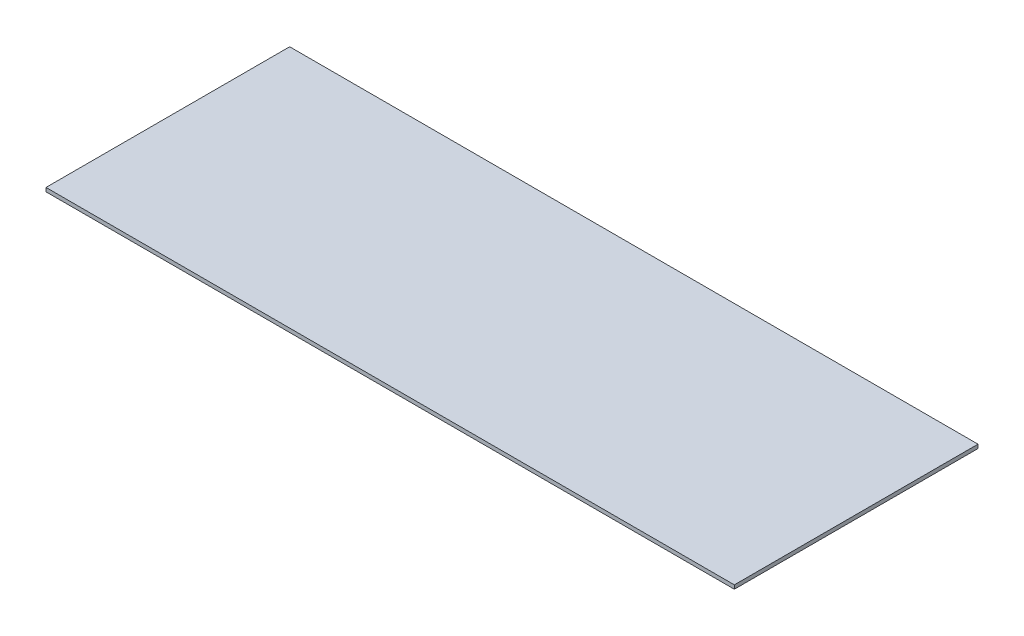
ISO-10303-21;
HEADER;
FILE_DESCRIPTION(('STEP AP214'),'2;1');
FILE_NAME('part.step','',(''),(''),'','','');
FILE_SCHEMA(('AUTOMOTIVE_DESIGN { 1 0 10303 214 1 1 1 1 }'));
ENDSEC;
DATA;
#1=APPLICATION_CONTEXT('core data for automotive mechanical design processes');
#2=APPLICATION_PROTOCOL_DEFINITION('international standard','automotive_design',2000,#1);
#3=PRODUCT_CONTEXT('',#1,'mechanical');
#4=PRODUCT('Part','Part','',(#3));
#5=PRODUCT_RELATED_PRODUCT_CATEGORY('part','',(#4));
#6=PRODUCT_DEFINITION_FORMATION('','',#4);
#7=PRODUCT_DEFINITION_CONTEXT('part definition',#1,'design');
#8=PRODUCT_DEFINITION('design','',#6,#7);
#9=PRODUCT_DEFINITION_SHAPE('','',#8);
#10=(LENGTH_UNIT() NAMED_UNIT(*) SI_UNIT(.MILLI.,.METRE.));
#11=(NAMED_UNIT(*) PLANE_ANGLE_UNIT() SI_UNIT($,.RADIAN.));
#12=(NAMED_UNIT(*) SI_UNIT($,.STERADIAN.) SOLID_ANGLE_UNIT());
#13=UNCERTAINTY_MEASURE_WITH_UNIT(LENGTH_MEASURE(1.E-05),#10,'distance_accuracy_value','');
#14=(GEOMETRIC_REPRESENTATION_CONTEXT(3) GLOBAL_UNCERTAINTY_ASSIGNED_CONTEXT((#13)) GLOBAL_UNIT_ASSIGNED_CONTEXT((#10,
#11,#12)) REPRESENTATION_CONTEXT('',''));
#15=CARTESIAN_POINT('',(0.,0.,0.));
#16=DIRECTION('',(0.,0.,1.));
#17=DIRECTION('',(1.,0.,0.));
#18=AXIS2_PLACEMENT_3D('',#15,#16,#17);
#19=CARTESIAN_POINT('',(0.,1.27,0.));
#20=DIRECTION('',(1.,0.,0.));
#21=DIRECTION('',(0.,0.,-1.));
#22=AXIS2_PLACEMENT_3D('',#19,#20,#21);
#23=PLANE('',#22);
#24=DIRECTION('',(0.,0.,1.));
#25=VECTOR('',#24,1.);
#26=CARTESIAN_POINT('',(0.,0.,0.));
#27=LINE('',#26,#25);
#28=CARTESIAN_POINT('',(0.,0.,-80.9625));
#29=VERTEX_POINT('',#28);
#30=CARTESIAN_POINT('',(0.,0.,0.));
#31=VERTEX_POINT('',#30);
#32=EDGE_CURVE('E96',#29,#31,#27,.T.);
#33=ORIENTED_EDGE('',*,*,#32,.T.);
#34=DIRECTION('',(0.,-1.,0.));
#35=VECTOR('',#34,1.);
#36=CARTESIAN_POINT('',(0.,1.27,0.));
#37=LINE('',#36,#35);
#38=CARTESIAN_POINT('',(0.,1.27,0.));
#39=VERTEX_POINT('',#38);
#40=EDGE_CURVE('E11',#39,#31,#37,.T.);
#41=ORIENTED_EDGE('',*,*,#40,.F.);
#42=DIRECTION('',(0.,0.,1.));
#43=VECTOR('',#42,1.);
#44=CARTESIAN_POINT('',(0.,1.27,0.));
#45=LINE('',#44,#43);
#46=CARTESIAN_POINT('',(0.,1.27,-80.9625));
#47=VERTEX_POINT('',#46);
#48=EDGE_CURVE('E84',#47,#39,#45,.T.);
#49=ORIENTED_EDGE('',*,*,#48,.F.);
#50=DIRECTION('',(0.,-1.,0.));
#51=VECTOR('',#50,1.);
#52=CARTESIAN_POINT('',(0.,1.27,-80.9625));
#53=LINE('',#52,#51);
#54=EDGE_CURVE('E92',#47,#29,#53,.T.);
#55=ORIENTED_EDGE('',*,*,#54,.T.);
#56=EDGE_LOOP('',(#33,#41,#49,#55));
#57=FACE_BOUND('',#56,.T.);
#58=ADVANCED_FACE('F33',(#57),#23,.F.);
#59=CARTESIAN_POINT('',(0.,1.27,0.));
#60=DIRECTION('',(0.,0.,-1.));
#61=DIRECTION('',(-1.,0.,0.));
#62=AXIS2_PLACEMENT_3D('',#59,#60,#61);
#63=PLANE('',#62);
#64=DIRECTION('',(1.,0.,0.));
#65=VECTOR('',#64,1.);
#66=CARTESIAN_POINT('',(0.,0.,0.));
#67=LINE('',#66,#65);
#68=CARTESIAN_POINT('',(228.727,0.,0.));
#69=VERTEX_POINT('',#68);
#70=EDGE_CURVE('E88',#31,#69,#67,.T.);
#71=ORIENTED_EDGE('',*,*,#70,.T.);
#72=DIRECTION('',(0.,-1.,0.));
#73=VECTOR('',#72,1.);
#74=CARTESIAN_POINT('',(228.727,1.27,0.));
#75=LINE('',#74,#73);
#76=CARTESIAN_POINT('',(228.727,1.27,0.));
#77=VERTEX_POINT('',#76);
#78=EDGE_CURVE('E41',#77,#69,#75,.T.);
#79=ORIENTED_EDGE('',*,*,#78,.F.);
#80=DIRECTION('',(1.,0.,0.));
#81=VECTOR('',#80,1.);
#82=CARTESIAN_POINT('',(0.,1.27,0.));
#83=LINE('',#82,#81);
#84=EDGE_CURVE('E79',#39,#77,#83,.T.);
#85=ORIENTED_EDGE('',*,*,#84,.F.);
#86=ORIENTED_EDGE('',*,*,#40,.T.);
#87=EDGE_LOOP('',(#71,#79,#85,#86));
#88=FACE_BOUND('',#87,.T.);
#89=ADVANCED_FACE('F87',(#88),#63,.F.);
#90=CARTESIAN_POINT('',(228.727,1.27,0.));
#91=DIRECTION('',(-1.,0.,0.));
#92=DIRECTION('',(0.,0.,1.));
#93=AXIS2_PLACEMENT_3D('',#90,#91,#92);
#94=PLANE('',#93);
#95=DIRECTION('',(0.,0.,-1.));
#96=VECTOR('',#95,1.);
#97=CARTESIAN_POINT('',(228.727,0.,0.));
#98=LINE('',#97,#96);
#99=CARTESIAN_POINT('',(228.727,0.,-80.9625));
#100=VERTEX_POINT('',#99);
#101=EDGE_CURVE('E66',#69,#100,#98,.T.);
#102=ORIENTED_EDGE('',*,*,#101,.T.);
#103=DIRECTION('',(0.,-1.,0.));
#104=VECTOR('',#103,1.);
#105=CARTESIAN_POINT('',(228.727,1.27,-80.9625));
#106=LINE('',#105,#104);
#107=CARTESIAN_POINT('',(228.727,1.27,-80.9625));
#108=VERTEX_POINT('',#107);
#109=EDGE_CURVE('E89',#108,#100,#106,.T.);
#110=ORIENTED_EDGE('',*,*,#109,.F.);
#111=DIRECTION('',(0.,0.,-1.));
#112=VECTOR('',#111,1.);
#113=CARTESIAN_POINT('',(228.727,1.27,0.));
#114=LINE('',#113,#112);
#115=EDGE_CURVE('E82',#77,#108,#114,.T.);
#116=ORIENTED_EDGE('',*,*,#115,.F.);
#117=ORIENTED_EDGE('',*,*,#78,.T.);
#118=EDGE_LOOP('',(#102,#110,#116,#117));
#119=FACE_BOUND('',#118,.T.);
#120=ADVANCED_FACE('F90',(#119),#94,.F.);
#121=CARTESIAN_POINT('',(0.,1.27,-80.9625));
#122=DIRECTION('',(0.,0.,1.));
#123=DIRECTION('',(1.,0.,0.));
#124=AXIS2_PLACEMENT_3D('',#121,#122,#123);
#125=PLANE('',#124);
#126=DIRECTION('',(-1.,0.,0.));
#127=VECTOR('',#126,1.);
#128=CARTESIAN_POINT('',(0.,0.,-80.9625));
#129=LINE('',#128,#127);
#130=EDGE_CURVE('E72',#100,#29,#129,.T.);
#131=ORIENTED_EDGE('',*,*,#130,.T.);
#132=ORIENTED_EDGE('',*,*,#54,.F.);
#133=DIRECTION('',(-1.,0.,0.));
#134=VECTOR('',#133,1.);
#135=CARTESIAN_POINT('',(0.,1.27,-80.9625));
#136=LINE('',#135,#134);
#137=EDGE_CURVE('E49',#108,#47,#136,.T.);
#138=ORIENTED_EDGE('',*,*,#137,.F.);
#139=ORIENTED_EDGE('',*,*,#109,.T.);
#140=EDGE_LOOP('',(#131,#132,#138,#139));
#141=FACE_BOUND('',#140,.T.);
#142=ADVANCED_FACE('F103',(#141),#125,.F.);
#143=CARTESIAN_POINT('',(0.,1.27,0.));
#144=DIRECTION('',(0.,-1.,0.));
#145=DIRECTION('',(0.,0.,-1.));
#146=AXIS2_PLACEMENT_3D('',#143,#144,#145);
#147=PLANE('',#146);
#148=ORIENTED_EDGE('',*,*,#48,.T.);
#149=ORIENTED_EDGE('',*,*,#84,.T.);
#150=ORIENTED_EDGE('',*,*,#115,.T.);
#151=ORIENTED_EDGE('',*,*,#137,.T.);
#152=EDGE_LOOP('',(#148,#149,#150,#151));
#153=FACE_BOUND('',#152,.T.);
#154=ADVANCED_FACE('F80',(#153),#147,.F.);
#155=CARTESIAN_POINT('',(0.,0.,0.));
#156=DIRECTION('',(0.,-1.,0.));
#157=DIRECTION('',(0.,0.,-1.));
#158=AXIS2_PLACEMENT_3D('',#155,#156,#157);
#159=PLANE('',#158);
#160=ORIENTED_EDGE('',*,*,#32,.F.);
#161=ORIENTED_EDGE('',*,*,#130,.F.);
#162=ORIENTED_EDGE('',*,*,#101,.F.);
#163=ORIENTED_EDGE('',*,*,#70,.F.);
#164=EDGE_LOOP('',(#160,#161,#162,#163));
#165=FACE_BOUND('',#164,.T.);
#166=ADVANCED_FACE('F106',(#165),#159,.T.);
#167=CLOSED_SHELL('',(#58,#89,#120,#142,#154,#166));
#168=MANIFOLD_SOLID_BREP('B2',#167);
#169=ADVANCED_BREP_SHAPE_REPRESENTATION('',(#18,#168),#14);
#170=SHAPE_DEFINITION_REPRESENTATION(#9,#169);
ENDSEC;
END-ISO-10303-21;
